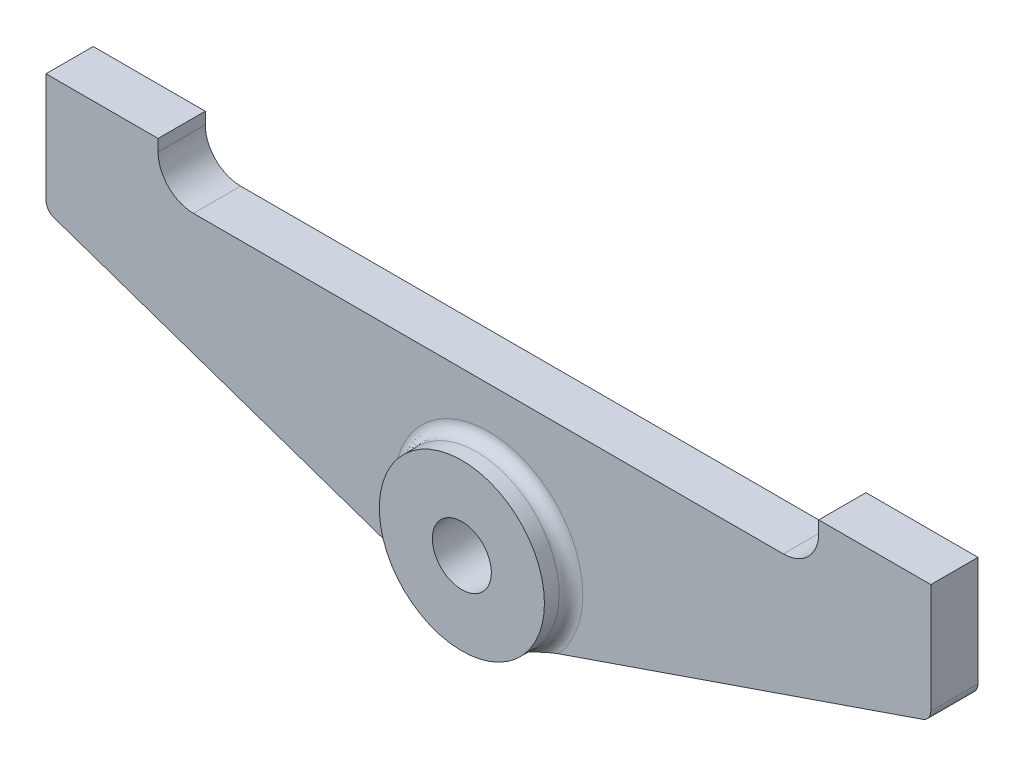
ISO-10303-21;
HEADER;
FILE_DESCRIPTION(('STEP AP214'),'2;1');
FILE_NAME('part.step','',(''),(''),'','','');
FILE_SCHEMA(('AUTOMOTIVE_DESIGN { 1 0 10303 214 1 1 1 1 }'));
ENDSEC;
DATA;
#1=APPLICATION_CONTEXT('core data for automotive mechanical design processes');
#2=APPLICATION_PROTOCOL_DEFINITION('international standard','automotive_design',2000,#1);
#3=PRODUCT_CONTEXT('',#1,'mechanical');
#4=PRODUCT('Part','Part','',(#3));
#5=PRODUCT_RELATED_PRODUCT_CATEGORY('part','',(#4));
#6=PRODUCT_DEFINITION_FORMATION('','',#4);
#7=PRODUCT_DEFINITION_CONTEXT('part definition',#1,'design');
#8=PRODUCT_DEFINITION('design','',#6,#7);
#9=PRODUCT_DEFINITION_SHAPE('','',#8);
#10=(LENGTH_UNIT() NAMED_UNIT(*) SI_UNIT(.MILLI.,.METRE.));
#11=(NAMED_UNIT(*) PLANE_ANGLE_UNIT() SI_UNIT($,.RADIAN.));
#12=(NAMED_UNIT(*) SI_UNIT($,.STERADIAN.) SOLID_ANGLE_UNIT());
#13=UNCERTAINTY_MEASURE_WITH_UNIT(LENGTH_MEASURE(1.E-05),#10,'distance_accuracy_value','');
#14=(GEOMETRIC_REPRESENTATION_CONTEXT(3) GLOBAL_UNCERTAINTY_ASSIGNED_CONTEXT((#13)) GLOBAL_UNIT_ASSIGNED_CONTEXT((#10,
#11,#12)) REPRESENTATION_CONTEXT('',''));
#15=CARTESIAN_POINT('',(0.,0.,0.));
#16=DIRECTION('',(0.,0.,1.));
#17=DIRECTION('',(1.,0.,0.));
#18=AXIS2_PLACEMENT_3D('',#15,#16,#17);
#19=CARTESIAN_POINT('',(0.,115.,20.));
#20=DIRECTION('',(0.,-1.,0.));
#21=DIRECTION('',(1.,0.,0.));
#22=AXIS2_PLACEMENT_3D('',#19,#20,#21);
#23=PLANE('',#22);
#24=DIRECTION('',(-1.,0.,0.));
#25=VECTOR('',#24,1.);
#26=CARTESIAN_POINT('',(0.,115.,20.));
#27=LINE('',#26,#25);
#28=CARTESIAN_POINT('',(250.,115.,20.));
#29=VERTEX_POINT('',#28);
#30=CARTESIAN_POINT('',(-250.,115.,20.));
#31=VERTEX_POINT('',#30);
#32=EDGE_CURVE('E170',#29,#31,#27,.T.);
#33=ORIENTED_EDGE('',*,*,#32,.F.);
#34=DIRECTION('',(0.,0.,-1.));
#35=VECTOR('',#34,1.);
#36=CARTESIAN_POINT('',(250.,115.,-20.));
#37=LINE('',#36,#35);
#38=CARTESIAN_POINT('',(250.,115.,-20.));
#39=VERTEX_POINT('',#38);
#40=EDGE_CURVE('E346',#29,#39,#37,.T.);
#41=ORIENTED_EDGE('',*,*,#40,.T.);
#42=DIRECTION('',(-1.,0.,0.));
#43=VECTOR('',#42,1.);
#44=CARTESIAN_POINT('',(0.,115.,-20.));
#45=LINE('',#44,#43);
#46=CARTESIAN_POINT('',(-250.,115.,-20.));
#47=VERTEX_POINT('',#46);
#48=EDGE_CURVE('E193',#39,#47,#45,.T.);
#49=ORIENTED_EDGE('',*,*,#48,.T.);
#50=DIRECTION('',(0.,0.,-1.));
#51=VECTOR('',#50,1.);
#52=CARTESIAN_POINT('',(-250.,115.,20.));
#53=LINE('',#52,#51);
#54=EDGE_CURVE('E350',#47,#31,#53,.F.);
#55=ORIENTED_EDGE('',*,*,#54,.T.);
#56=EDGE_LOOP('',(#33,#41,#49,#55));
#57=FACE_BOUND('',#56,.T.);
#58=ADVANCED_FACE('F39',(#57),#23,.F.);
#59=CARTESIAN_POINT('',(-280.,-3.88578058618805E-13,20.));
#60=DIRECTION('',(1.,0.,0.));
#61=DIRECTION('',(0.,1.,0.));
#62=AXIS2_PLACEMENT_3D('',#59,#60,#61);
#63=PLANE('',#62);
#64=DIRECTION('',(0.,-1.,0.));
#65=VECTOR('',#64,1.);
#66=CARTESIAN_POINT('',(-280.,-3.88578058618805E-13,20.));
#67=LINE('',#66,#65);
#68=CARTESIAN_POINT('',(-280.,155.,20.));
#69=VERTEX_POINT('',#68);
#70=CARTESIAN_POINT('',(-280.,145.,20.));
#71=VERTEX_POINT('',#70);
#72=EDGE_CURVE('E153',#69,#71,#67,.T.);
#73=ORIENTED_EDGE('',*,*,#72,.T.);
#74=DIRECTION('',(0.,0.,-1.));
#75=VECTOR('',#74,1.);
#76=CARTESIAN_POINT('',(-280.,145.,20.));
#77=LINE('',#76,#75);
#78=CARTESIAN_POINT('',(-280.,145.,-20.));
#79=VERTEX_POINT('',#78);
#80=EDGE_CURVE('E353',#71,#79,#77,.T.);
#81=ORIENTED_EDGE('',*,*,#80,.T.);
#82=DIRECTION('',(0.,-1.,0.));
#83=VECTOR('',#82,1.);
#84=CARTESIAN_POINT('',(-280.,-3.88578058618805E-13,-20.));
#85=LINE('',#84,#83);
#86=CARTESIAN_POINT('',(-280.,155.,-20.));
#87=VERTEX_POINT('',#86);
#88=EDGE_CURVE('E154',#87,#79,#85,.T.);
#89=ORIENTED_EDGE('',*,*,#88,.F.);
#90=DIRECTION('',(0.,0.,-1.));
#91=VECTOR('',#90,1.);
#92=CARTESIAN_POINT('',(-280.,155.,20.));
#93=LINE('',#92,#91);
#94=EDGE_CURVE('E151',#69,#87,#93,.T.);
#95=ORIENTED_EDGE('',*,*,#94,.F.);
#96=EDGE_LOOP('',(#73,#81,#89,#95));
#97=FACE_BOUND('',#96,.T.);
#98=ADVANCED_FACE('F155',(#97),#63,.T.);
#99=CARTESIAN_POINT('',(0.,155.,20.));
#100=DIRECTION('',(0.,1.,0.));
#101=DIRECTION('',(0.,0.,1.));
#102=AXIS2_PLACEMENT_3D('',#99,#100,#101);
#103=PLANE('',#102);
#104=DIRECTION('',(1.,0.,0.));
#105=VECTOR('',#104,1.);
#106=CARTESIAN_POINT('',(0.,155.,-20.));
#107=LINE('',#106,#105);
#108=CARTESIAN_POINT('',(-375.,155.,-20.));
#109=VERTEX_POINT('',#108);
#110=EDGE_CURVE('E198',#109,#87,#107,.T.);
#111=ORIENTED_EDGE('',*,*,#110,.F.);
#112=DIRECTION('',(0.,0.,-1.));
#113=VECTOR('',#112,1.);
#114=CARTESIAN_POINT('',(-375.,155.,20.));
#115=LINE('',#114,#113);
#116=CARTESIAN_POINT('',(-375.,155.,20.));
#117=VERTEX_POINT('',#116);
#118=EDGE_CURVE('E161',#117,#109,#115,.T.);
#119=ORIENTED_EDGE('',*,*,#118,.F.);
#120=DIRECTION('',(1.,0.,0.));
#121=VECTOR('',#120,1.);
#122=CARTESIAN_POINT('',(0.,155.,20.));
#123=LINE('',#122,#121);
#124=EDGE_CURVE('E167',#117,#69,#123,.T.);
#125=ORIENTED_EDGE('',*,*,#124,.T.);
#126=ORIENTED_EDGE('',*,*,#94,.T.);
#127=EDGE_LOOP('',(#111,#119,#125,#126));
#128=FACE_BOUND('',#127,.T.);
#129=ADVANCED_FACE('F168',(#128),#103,.T.);
#130=CARTESIAN_POINT('',(-375.,0.,20.));
#131=DIRECTION('',(-1.,0.,0.));
#132=DIRECTION('',(0.,0.,1.));
#133=AXIS2_PLACEMENT_3D('',#130,#131,#132);
#134=PLANE('',#133);
#135=DIRECTION('',(0.,1.,0.));
#136=VECTOR('',#135,1.);
#137=CARTESIAN_POINT('',(-375.,0.,-20.));
#138=LINE('',#137,#136);
#139=CARTESIAN_POINT('',(-375.,62.1346429358154,-20.));
#140=VERTEX_POINT('',#139);
#141=EDGE_CURVE('E196',#140,#109,#138,.T.);
#142=ORIENTED_EDGE('',*,*,#141,.F.);
#143=DIRECTION('',(0.,0.,-1.));
#144=VECTOR('',#143,1.);
#145=CARTESIAN_POINT('',(-375.,62.1346429358154,20.));
#146=LINE('',#145,#144);
#147=CARTESIAN_POINT('',(-375.,62.1346429358154,20.));
#148=VERTEX_POINT('',#147);
#149=EDGE_CURVE('E236',#140,#148,#146,.F.);
#150=ORIENTED_EDGE('',*,*,#149,.T.);
#151=DIRECTION('',(0.,1.,0.));
#152=VECTOR('',#151,1.);
#153=CARTESIAN_POINT('',(-375.,0.,20.));
#154=LINE('',#153,#152);
#155=EDGE_CURVE('E175',#148,#117,#154,.T.);
#156=ORIENTED_EDGE('',*,*,#155,.T.);
#157=ORIENTED_EDGE('',*,*,#118,.T.);
#158=EDGE_LOOP('',(#142,#150,#156,#157));
#159=FACE_BOUND('',#158,.T.);
#160=ADVANCED_FACE('F277',(#159),#134,.T.);
#161=CARTESIAN_POINT('',(-22.7747490496245,-66.1914707928946,20.));
#162=DIRECTION('',(-0.325353557851779,-0.945592439898495,0.));
#163=DIRECTION('',(0.945592439898495,-0.325353557851779,0.));
#164=AXIS2_PLACEMENT_3D('',#161,#162,#163);
#165=PLANE('',#164);
#166=DIRECTION('',(-0.945592439898495,0.325353557851779,0.));
#167=VECTOR('',#166,1.);
#168=CARTESIAN_POINT('',(-22.7747490496245,-66.1914707928946,20.));
#169=LINE('',#168,#167);
#170=CARTESIAN_POINT('',(-59.3973867698898,-53.5905816810018,20.));
#171=VERTEX_POINT('',#170);
#172=CARTESIAN_POINT('',(-368.253535578518,52.6787185368305,20.));
#173=VERTEX_POINT('',#172);
#174=EDGE_CURVE('E173',#171,#173,#169,.T.);
#175=ORIENTED_EDGE('',*,*,#174,.T.);
#176=DIRECTION('',(0.,0.,-1.));
#177=VECTOR('',#176,1.);
#178=CARTESIAN_POINT('',(-368.253535578518,52.6787185368305,20.));
#179=LINE('',#178,#177);
#180=CARTESIAN_POINT('',(-368.253535578518,52.6787185368305,-20.));
#181=VERTEX_POINT('',#180);
#182=EDGE_CURVE('E232',#173,#181,#179,.T.);
#183=ORIENTED_EDGE('',*,*,#182,.T.);
#184=DIRECTION('',(-0.945592439898495,0.325353557851779,0.));
#185=VECTOR('',#184,1.);
#186=CARTESIAN_POINT('',(-22.7747490496245,-66.1914707928946,-20.));
#187=LINE('',#186,#185);
#188=CARTESIAN_POINT('',(-59.3973867698898,-53.5905816810018,-20.));
#189=VERTEX_POINT('',#188);
#190=EDGE_CURVE('E199',#189,#181,#187,.T.);
#191=ORIENTED_EDGE('',*,*,#190,.F.);
#192=CARTESIAN_POINT('',(-59.3973867698898,-53.5905816810018,-20.));
#193=CARTESIAN_POINT('',(-59.0260316504525,-53.7183552378085,-20.0000108187344));
#194=CARTESIAN_POINT('',(-58.6546955385982,-53.8461222546045,-20.0054220064182));
#195=CARTESIAN_POINT('',(-57.9123145948687,-54.1015560663952,-20.0263673057299));
#196=CARTESIAN_POINT('',(-57.5412697367176,-54.2292228704308,-20.0419003645525));
#197=CARTESIAN_POINT('',(-56.7998604067485,-54.4843223754098,-20.0824002315136));
#198=CARTESIAN_POINT('',(-56.4294956664168,-54.6117551687417,-20.1073616112963));
#199=CARTESIAN_POINT('',(-55.6893898749287,-54.8664061603181,-20.166114990627));
#200=CARTESIAN_POINT('',(-55.3196488429558,-54.9936243519621,-20.1999072569769));
#201=CARTESIAN_POINT('',(-54.2135517844252,-55.3742033394178,-20.3134713294302));
#202=CARTESIAN_POINT('',(-53.4783047573858,-55.6271825575817,-20.4055469160525));
#203=CARTESIAN_POINT('',(-52.0115085725691,-56.131868654083,-20.6185717300036));
#204=CARTESIAN_POINT('',(-51.2799600470955,-56.3835753148614,-20.739525734625));
#205=CARTESIAN_POINT('',(-49.8273401850121,-56.8833837105225,-21.0056890619337));
#206=CARTESIAN_POINT('',(-49.1062328950336,-57.1314978160166,-21.1506802827535));
#207=CARTESIAN_POINT('',(-47.6682826634237,-57.6262587765825,-21.4626652846524));
#208=CARTESIAN_POINT('',(-46.951439901482,-57.8729055698279,-21.6296599861012));
#209=CARTESIAN_POINT('',(-45.5215508712773,-58.3648928824171,-21.9831215283727));
#210=CARTESIAN_POINT('',(-44.8085076070761,-58.610232368142,-22.1696018988783));
#211=CARTESIAN_POINT('',(-43.3865930390222,-59.099475877457,-22.5595522472506));
#212=CARTESIAN_POINT('',(-42.6777218017207,-59.3433798781484,-22.7630224953543));
#213=CARTESIAN_POINT('',(-41.1585875401379,-59.8660741341575,-23.2162035668402));
#214=CARTESIAN_POINT('',(-40.3489586212955,-60.1446462104246,-23.4682864908147));
#215=CARTESIAN_POINT('',(-38.734467446616,-60.7001502792375,-23.989012850719));
#216=CARTESIAN_POINT('',(-37.9296053700097,-60.9770822101145,-24.2576569050598));
#217=CARTESIAN_POINT('',(-35.5217849385116,-61.8055500689948,-25.0841036396305));
#218=CARTESIAN_POINT('',(-33.9251713638538,-62.3549029245284,-25.6625495982535));
#219=CARTESIAN_POINT('',(-30.7409827313629,-63.4504987190164,-26.8556566469305));
#220=CARTESIAN_POINT('',(-29.1534296586136,-63.9967340934799,-27.4703822971833));
#221=CARTESIAN_POINT('',(-25.9844238297866,-65.0871058834359,-28.7171444273322));
#222=CARTESIAN_POINT('',(-24.4029711923367,-65.6312422581116,-29.349181241941));
#223=CARTESIAN_POINT('',(-22.8059520077258,-66.1807346733939,-29.987527809775));
#224=CARTESIAN_POINT('',(-22.7903505284301,-66.1861027332286,-29.99376390542));
#225=CARTESIAN_POINT('',(-22.7747490496245,-66.1914707928946,-30.));
#226=B_SPLINE_CURVE_WITH_KNOTS('',3,(#192,#193,#194,#195,#196,#197,#198,#199,#200,#201,#202,
#203,#204,#205,#206,#207,#208,#209,#210,#211,#212,#213,#214,#215,#216,#217,#218,#219,#220,#221,
#222,#223,#224,#225),.UNSPECIFIED.,.F.,.F.,(4,2,2,2,2,2,2,2,2,2,2,2,2,2,2,2,4),(0.,
1.17809995057752,2.35607738310343,3.53337762637551,4.7107134427919,7.05898169989058,
9.40763869528582,11.7360472704723,14.064553270128,16.3946869258984,18.7248576512821,
21.4023050670364,24.0798525222899,29.4335577856076,34.797095451106,40.1607368943486,
40.21365192057),.UNSPECIFIED.);
#227=CARTESIAN_POINT('',(-22.7747490496246,-66.1914707928946,-30.));
#228=VERTEX_POINT('',#227);
#229=EDGE_CURVE('E253',#189,#228,#226,.T.);
#230=ORIENTED_EDGE('',*,*,#229,.T.);
#231=DIRECTION('',(0.,0.,-1.));
#232=VECTOR('',#231,1.);
#233=CARTESIAN_POINT('',(-22.7747490496246,-66.1914707928945,20.));
#234=LINE('',#233,#232);
#235=CARTESIAN_POINT('',(-22.7747490496246,-66.1914707928946,30.));
#236=VERTEX_POINT('',#235);
#237=EDGE_CURVE('E219',#236,#228,#234,.T.);
#238=ORIENTED_EDGE('',*,*,#237,.F.);
#239=CARTESIAN_POINT('',(-59.3973867698898,-53.5905816810018,20.));
#240=CARTESIAN_POINT('',(-59.0260316504525,-53.7183552378085,20.0000108187344));
#241=CARTESIAN_POINT('',(-58.6546955385982,-53.8461222546045,20.0054220064182));
#242=CARTESIAN_POINT('',(-57.9123145948687,-54.1015560663952,20.0263673057299));
#243=CARTESIAN_POINT('',(-57.5412697367176,-54.2292228704308,20.0419003645525));
#244=CARTESIAN_POINT('',(-56.7998604067485,-54.4843223754098,20.0824002315136));
#245=CARTESIAN_POINT('',(-56.4294956664167,-54.6117551687417,20.1073616112963));
#246=CARTESIAN_POINT('',(-55.6893898749287,-54.8664061603181,20.1661149906269));
#247=CARTESIAN_POINT('',(-55.3196488429558,-54.9936243519621,20.1999072569769));
#248=CARTESIAN_POINT('',(-54.2135517844252,-55.3742033394178,20.3134713294302));
#249=CARTESIAN_POINT('',(-53.4783047573858,-55.6271825575817,20.4055469160525));
#250=CARTESIAN_POINT('',(-52.0115085725691,-56.131868654083,20.6185717300036));
#251=CARTESIAN_POINT('',(-51.2799600470955,-56.3835753148614,20.739525734625));
#252=CARTESIAN_POINT('',(-49.8273401850121,-56.8833837105225,21.0056890619337));
#253=CARTESIAN_POINT('',(-49.1062328950336,-57.1314978160166,21.1506802827535));
#254=CARTESIAN_POINT('',(-47.6682826634237,-57.6262587765825,21.4626652846524));
#255=CARTESIAN_POINT('',(-46.951439901482,-57.8729055698279,21.6296599861012));
#256=CARTESIAN_POINT('',(-45.5215508712773,-58.3648928824171,21.9831215283727));
#257=CARTESIAN_POINT('',(-44.8085076070762,-58.610232368142,22.1696018988783));
#258=CARTESIAN_POINT('',(-43.3865930390222,-59.099475877457,22.5595522472506));
#259=CARTESIAN_POINT('',(-42.6777218017207,-59.3433798781484,22.7630224953543));
#260=CARTESIAN_POINT('',(-41.1585875401379,-59.8660741341575,23.2162035668402));
#261=CARTESIAN_POINT('',(-40.3489586212955,-60.1446462104246,23.4682864908147));
#262=CARTESIAN_POINT('',(-38.734467446616,-60.7001502792375,23.989012850719));
#263=CARTESIAN_POINT('',(-37.9296053700097,-60.9770822101145,24.2576569050598));
#264=CARTESIAN_POINT('',(-35.5217849385116,-61.8055500689948,25.0841036396305));
#265=CARTESIAN_POINT('',(-33.9251713638538,-62.3549029245284,25.6625495982535));
#266=CARTESIAN_POINT('',(-30.7409827313629,-63.4504987190164,26.8556566469305));
#267=CARTESIAN_POINT('',(-29.1534296586136,-63.9967340934799,27.4703822971833));
#268=CARTESIAN_POINT('',(-25.9844238297866,-65.0871058834359,28.7171444273322));
#269=CARTESIAN_POINT('',(-24.4029711923367,-65.6312422581116,29.349181241941));
#270=CARTESIAN_POINT('',(-22.8059520077258,-66.1807346733939,29.987527809775));
#271=CARTESIAN_POINT('',(-22.7903505284301,-66.1861027332286,29.99376390542));
#272=CARTESIAN_POINT('',(-22.7747490496245,-66.1914707928946,30.));
#273=B_SPLINE_CURVE_WITH_KNOTS('',3,(#239,#240,#241,#242,#243,#244,#245,#246,#247,#248,#249,
#250,#251,#252,#253,#254,#255,#256,#257,#258,#259,#260,#261,#262,#263,#264,#265,#266,#267,#268,
#269,#270,#271,#272),.UNSPECIFIED.,.F.,.F.,(4,2,2,2,2,2,2,2,2,2,2,2,2,2,2,2,4),(0.,
1.17809995057753,2.35607738310344,3.53337762637552,4.7107134427919,7.05898169989058,
9.40763869528582,11.7360472704723,14.064553270128,16.3946869258984,18.7248576512821,
21.4023050670364,24.0798525222899,29.4335577856075,34.797095451106,40.1607368943486,
40.2136519205699),.UNSPECIFIED.);
#274=EDGE_CURVE('E285',#236,#171,#273,.F.);
#275=ORIENTED_EDGE('',*,*,#274,.T.);
#276=EDGE_LOOP('',(#175,#183,#191,#230,#238,#275));
#277=FACE_BOUND('',#276,.T.);
#278=ADVANCED_FACE('F271',(#277),#165,.T.);
#279=CARTESIAN_POINT('',(22.7747490496246,-66.1914707928947,20.));
#280=DIRECTION('',(-0.325353557851779,0.945592439898495,0.));
#281=DIRECTION('',(-0.945592439898495,-0.325353557851779,0.));
#282=AXIS2_PLACEMENT_3D('',#279,#280,#281);
#283=PLANE('',#282);
#284=DIRECTION('',(0.945592439898495,0.325353557851779,0.));
#285=VECTOR('',#284,1.);
#286=CARTESIAN_POINT('',(22.7747490496246,-66.1914707928947,-20.));
#287=LINE('',#286,#285);
#288=CARTESIAN_POINT('',(59.3973867698897,-53.5905816810019,-20.));
#289=VERTEX_POINT('',#288);
#290=CARTESIAN_POINT('',(368.253535578518,52.6787185368304,-20.));
#291=VERTEX_POINT('',#290);
#292=EDGE_CURVE('E201',#289,#291,#287,.T.);
#293=ORIENTED_EDGE('',*,*,#292,.T.);
#294=DIRECTION('',(0.,0.,-1.));
#295=VECTOR('',#294,1.);
#296=CARTESIAN_POINT('',(368.253535578518,52.6787185368304,20.));
#297=LINE('',#296,#295);
#298=CARTESIAN_POINT('',(368.253535578518,52.6787185368304,20.));
#299=VERTEX_POINT('',#298);
#300=EDGE_CURVE('E249',#291,#299,#297,.F.);
#301=ORIENTED_EDGE('',*,*,#300,.T.);
#302=DIRECTION('',(0.945592439898495,0.325353557851779,0.));
#303=VECTOR('',#302,1.);
#304=CARTESIAN_POINT('',(22.7747490496246,-66.1914707928947,20.));
#305=LINE('',#304,#303);
#306=CARTESIAN_POINT('',(59.3973867698897,-53.5905816810019,20.));
#307=VERTEX_POINT('',#306);
#308=EDGE_CURVE('E177',#307,#299,#305,.T.);
#309=ORIENTED_EDGE('',*,*,#308,.F.);
#310=CARTESIAN_POINT('',(59.3973867698897,-53.5905816810019,20.));
#311=CARTESIAN_POINT('',(59.0260316504784,-53.7183552377997,20.0000108187344));
#312=CARTESIAN_POINT('',(58.65469553865,-53.8461222545868,20.0054220064175));
#313=CARTESIAN_POINT('',(57.9123145949725,-54.1015560663596,20.0263673057263));
#314=CARTESIAN_POINT('',(57.5412697368474,-54.2292228703862,20.0419003645467));
#315=CARTESIAN_POINT('',(56.79986040693,-54.4843223753474,20.0824002315024));
#316=CARTESIAN_POINT('',(56.4294956666241,-54.6117551686704,20.1073616112817));
#317=CARTESIAN_POINT('',(55.6893898751875,-54.8664061602292,20.1661149906045));
#318=CARTESIAN_POINT('',(55.3196488432402,-54.9936243518644,20.19990725695));
#319=CARTESIAN_POINT('',(54.2135517847755,-55.3742033392974,20.3134713293895));
#320=CARTESIAN_POINT('',(53.4783047577762,-55.6271825574475,20.4055469160015));
#321=CARTESIAN_POINT('',(52.0115085730392,-56.1318686539214,20.6185717299295));
#322=CARTESIAN_POINT('',(51.2799600476052,-56.3835753146861,20.7395257345381));
#323=CARTESIAN_POINT('',(49.8273401855117,-56.8833837103507,21.0056890618356));
#324=CARTESIAN_POINT('',(49.1062328954841,-57.1314978158617,21.15068028266));
#325=CARTESIAN_POINT('',(47.6682826637765,-57.6262587764612,21.4626652845716));
#326=CARTESIAN_POINT('',(46.9514399017863,-57.8729055697233,21.6296599860285));
#327=CARTESIAN_POINT('',(45.5215508714899,-58.364892882344,21.9831215283176));
#328=CARTESIAN_POINT('',(44.8085076072456,-58.6102323680838,22.1696018988326));
#329=CARTESIAN_POINT('',(43.3865930391064,-59.0994758774281,22.5595522472265));
#330=CARTESIAN_POINT('',(42.6777218017627,-59.3433798781341,22.7630224953423));
#331=CARTESIAN_POINT('',(41.1585875401339,-59.8660741341589,23.2162035668405));
#332=CARTESIAN_POINT('',(40.3489586212873,-60.1446462104276,23.4682864908139));
#333=CARTESIAN_POINT('',(38.7344674466025,-60.7001502792422,23.9890128507266));
#334=CARTESIAN_POINT('',(37.9296053699951,-60.9770822101197,24.2576569050768));
#335=CARTESIAN_POINT('',(35.521784938461,-61.8055500690124,25.0841036396235));
#336=CARTESIAN_POINT('',(33.9251713637483,-62.354902924565,25.6625495981569));
#337=CARTESIAN_POINT('',(30.7409827313339,-63.4504987190263,26.8556566470773));
#338=CARTESIAN_POINT('',(29.1534296587162,-63.9967340934441,27.4703822976634));
#339=CARTESIAN_POINT('',(25.9844238295904,-65.0871058835041,28.7171444268876));
#340=CARTESIAN_POINT('',(24.4029711917102,-65.6312422583296,29.3491812402385));
#341=CARTESIAN_POINT('',(22.8059520077137,-66.1807346733981,29.9875278097414));
#342=CARTESIAN_POINT('',(22.790350528424,-66.1861027332307,29.9937639054031));
#343=CARTESIAN_POINT('',(22.7747490496246,-66.1914707928946,30.));
#344=B_SPLINE_CURVE_WITH_KNOTS('',3,(#310,#311,#312,#313,#314,#315,#316,#317,#318,#319,#320,
#321,#322,#323,#324,#325,#326,#327,#328,#329,#330,#331,#332,#333,#334,#335,#336,#337,#338,#339,
#340,#341,#342,#343),.UNSPECIFIED.,.F.,.F.,(4,2,2,2,2,2,2,2,2,2,2,2,2,2,2,2,4),(0.,
1.17809995049501,2.35607738293844,3.53337762612827,4.71071344246241,7.05898169943125,
9.40763869469648,11.7360472700386,14.0645532698499,16.3946869257599,18.7248576512823,
21.4023050670479,24.0798525223147,29.4335577857004,34.7970954511615,40.1607368943486,
40.2136519205699),.UNSPECIFIED.);
#345=CARTESIAN_POINT('',(22.7747490496246,-66.1914707928947,30.));
#346=VERTEX_POINT('',#345);
#347=EDGE_CURVE('E289',#307,#346,#344,.T.);
#348=ORIENTED_EDGE('',*,*,#347,.T.);
#349=DIRECTION('',(0.,0.,-1.));
#350=VECTOR('',#349,1.);
#351=CARTESIAN_POINT('',(22.7747490496246,-66.1914707928947,20.));
#352=LINE('',#351,#350);
#353=CARTESIAN_POINT('',(22.7747490496246,-66.1914707928947,-30.));
#354=VERTEX_POINT('',#353);
#355=EDGE_CURVE('E217',#346,#354,#352,.T.);
#356=ORIENTED_EDGE('',*,*,#355,.T.);
#357=CARTESIAN_POINT('',(59.3973867698897,-53.5905816810019,-20.));
#358=CARTESIAN_POINT('',(59.0260316504799,-53.7183552377992,-20.0000108187344));
#359=CARTESIAN_POINT('',(58.654695538653,-53.8461222545857,-20.0054220064174));
#360=CARTESIAN_POINT('',(57.9123145949785,-54.1015560663575,-20.0263673057261));
#361=CARTESIAN_POINT('',(57.5412697368549,-54.2292228703837,-20.0419003645464));
#362=CARTESIAN_POINT('',(56.7998604069404,-54.4843223753438,-20.0824002315017));
#363=CARTESIAN_POINT('',(56.4294956666359,-54.6117551686663,-20.1073616112809));
#364=CARTESIAN_POINT('',(55.6893898752023,-54.8664061602241,-20.1661149906033));
#365=CARTESIAN_POINT('',(55.3196488432565,-54.9936243518588,-20.1999072569485));
#366=CARTESIAN_POINT('',(54.2135517847956,-55.3742033392905,-20.3134713293872));
#367=CARTESIAN_POINT('',(53.4783047577985,-55.6271825574398,-20.4055469159986));
#368=CARTESIAN_POINT('',(52.0115085730661,-56.1318686539122,-20.6185717299253));
#369=CARTESIAN_POINT('',(51.2799600476343,-56.3835753146761,-20.7395257345332));
#370=CARTESIAN_POINT('',(49.8273401855403,-56.8833837103409,-21.00568906183));
#371=CARTESIAN_POINT('',(49.1062328955099,-57.1314978158528,-21.1506802826546));
#372=CARTESIAN_POINT('',(47.6682826637967,-57.6262587764543,-21.462665284567));
#373=CARTESIAN_POINT('',(46.9514399018037,-57.8729055697173,-21.6296599860243));
#374=CARTESIAN_POINT('',(45.5215508715021,-58.3648928823398,-21.9831215283144));
#375=CARTESIAN_POINT('',(44.8085076072554,-58.6102323680805,-22.16960189883));
#376=CARTESIAN_POINT('',(43.3865930391112,-59.0994758774265,-22.5595522472252));
#377=CARTESIAN_POINT('',(42.6777218017652,-59.3433798781332,-22.7630224953417));
#378=CARTESIAN_POINT('',(41.1585875401337,-59.866074134159,-23.2162035668405));
#379=CARTESIAN_POINT('',(40.3489586212868,-60.1446462104277,-23.4682864908139));
#380=CARTESIAN_POINT('',(38.7344674466018,-60.7001502792425,-23.989012850727));
#381=CARTESIAN_POINT('',(37.9296053699943,-60.9770822101199,-24.2576569050778));
#382=CARTESIAN_POINT('',(35.5217849384582,-61.8055500690133,-25.0841036396231));
#383=CARTESIAN_POINT('',(33.9251713637423,-62.3549029245671,-25.6625495981513));
#384=CARTESIAN_POINT('',(30.7409827313324,-63.4504987190268,-26.8556566470857));
#385=CARTESIAN_POINT('',(29.1534296587222,-63.996734093442,-27.4703822976908));
#386=CARTESIAN_POINT('',(25.9844238295794,-65.087105883508,-28.7171444268622));
#387=CARTESIAN_POINT('',(24.4029711916746,-65.631242258342,-29.349181240141));
#388=CARTESIAN_POINT('',(22.8059520077132,-66.1807346733983,-29.9875278097395));
#389=CARTESIAN_POINT('',(22.7903505284237,-66.1861027332308,-29.9937639054021));
#390=CARTESIAN_POINT('',(22.7747490496246,-66.1914707928946,-30.));
#391=B_SPLINE_CURVE_WITH_KNOTS('',3,(#357,#358,#359,#360,#361,#362,#363,#364,#365,#366,#367,
#368,#369,#370,#371,#372,#373,#374,#375,#376,#377,#378,#379,#380,#381,#382,#383,#384,#385,#386,
#387,#388,#389,#390),.UNSPECIFIED.,.F.,.F.,(4,2,2,2,2,2,2,2,2,2,2,2,2,2,2,2,4),(0.,
1.17809995049029,2.35607738292899,3.53337762611411,4.71071344244355,7.05898169940497,
9.40763869466276,11.7360472700138,14.0645532698339,16.3946869257519,18.7248576512823,
21.4023050670485,24.0798525223161,29.4335577857056,34.7970954511645,40.1607368943483,
40.2136519205699),.UNSPECIFIED.);
#392=EDGE_CURVE('E257',#354,#289,#391,.F.);
#393=ORIENTED_EDGE('',*,*,#392,.T.);
#394=EDGE_LOOP('',(#293,#301,#309,#348,#356,#393));
#395=FACE_BOUND('',#394,.T.);
#396=ADVANCED_FACE('F274',(#395),#283,.F.);
#397=CARTESIAN_POINT('',(375.,0.,20.));
#398=DIRECTION('',(-1.,0.,0.));
#399=DIRECTION('',(0.,0.,1.));
#400=AXIS2_PLACEMENT_3D('',#397,#398,#399);
#401=PLANE('',#400);
#402=DIRECTION('',(0.,1.,0.));
#403=VECTOR('',#402,1.);
#404=CARTESIAN_POINT('',(375.,0.,20.));
#405=LINE('',#404,#403);
#406=CARTESIAN_POINT('',(375.,62.1346429358154,20.));
#407=VERTEX_POINT('',#406);
#408=CARTESIAN_POINT('',(375.,155.,20.));
#409=VERTEX_POINT('',#408);
#410=EDGE_CURVE('E181',#407,#409,#405,.T.);
#411=ORIENTED_EDGE('',*,*,#410,.F.);
#412=DIRECTION('',(0.,0.,-1.));
#413=VECTOR('',#412,1.);
#414=CARTESIAN_POINT('',(375.,62.1346429358154,20.));
#415=LINE('',#414,#413);
#416=CARTESIAN_POINT('',(375.,62.1346429358154,-20.));
#417=VERTEX_POINT('',#416);
#418=EDGE_CURVE('E248',#407,#417,#415,.T.);
#419=ORIENTED_EDGE('',*,*,#418,.T.);
#420=DIRECTION('',(0.,1.,0.));
#421=VECTOR('',#420,1.);
#422=CARTESIAN_POINT('',(375.,0.,-20.));
#423=LINE('',#422,#421);
#424=CARTESIAN_POINT('',(375.,155.,-20.));
#425=VERTEX_POINT('',#424);
#426=EDGE_CURVE('E206',#417,#425,#423,.T.);
#427=ORIENTED_EDGE('',*,*,#426,.T.);
#428=DIRECTION('',(0.,0.,-1.));
#429=VECTOR('',#428,1.);
#430=CARTESIAN_POINT('',(375.,155.,20.));
#431=LINE('',#430,#429);
#432=EDGE_CURVE('E214',#409,#425,#431,.T.);
#433=ORIENTED_EDGE('',*,*,#432,.F.);
#434=EDGE_LOOP('',(#411,#419,#427,#433));
#435=FACE_BOUND('',#434,.T.);
#436=ADVANCED_FACE('F380',(#435),#401,.F.);
#437=CARTESIAN_POINT('',(0.,155.,20.));
#438=DIRECTION('',(0.,-1.,0.));
#439=DIRECTION('',(0.,0.,-1.));
#440=AXIS2_PLACEMENT_3D('',#437,#438,#439);
#441=PLANE('',#440);
#442=DIRECTION('',(-1.,0.,0.));
#443=VECTOR('',#442,1.);
#444=CARTESIAN_POINT('',(0.,155.,-20.));
#445=LINE('',#444,#443);
#446=CARTESIAN_POINT('',(280.,155.,-20.));
#447=VERTEX_POINT('',#446);
#448=EDGE_CURVE('E208',#425,#447,#445,.T.);
#449=ORIENTED_EDGE('',*,*,#448,.T.);
#450=DIRECTION('',(0.,0.,-1.));
#451=VECTOR('',#450,1.);
#452=CARTESIAN_POINT('',(280.,155.,20.));
#453=LINE('',#452,#451);
#454=CARTESIAN_POINT('',(280.,155.,20.));
#455=VERTEX_POINT('',#454);
#456=EDGE_CURVE('E189',#455,#447,#453,.T.);
#457=ORIENTED_EDGE('',*,*,#456,.F.);
#458=DIRECTION('',(-1.,0.,0.));
#459=VECTOR('',#458,1.);
#460=CARTESIAN_POINT('',(0.,155.,20.));
#461=LINE('',#460,#459);
#462=EDGE_CURVE('E183',#409,#455,#461,.T.);
#463=ORIENTED_EDGE('',*,*,#462,.F.);
#464=ORIENTED_EDGE('',*,*,#432,.T.);
#465=EDGE_LOOP('',(#449,#457,#463,#464));
#466=FACE_BOUND('',#465,.T.);
#467=ADVANCED_FACE('F375',(#466),#441,.F.);
#468=CARTESIAN_POINT('',(280.,-3.88578058618804E-13,20.));
#469=DIRECTION('',(1.,0.,0.));
#470=DIRECTION('',(0.,1.,0.));
#471=AXIS2_PLACEMENT_3D('',#468,#469,#470);
#472=PLANE('',#471);
#473=DIRECTION('',(0.,-1.,0.));
#474=VECTOR('',#473,1.);
#475=CARTESIAN_POINT('',(280.,-3.88578058618804E-13,-20.));
#476=LINE('',#475,#474);
#477=CARTESIAN_POINT('',(280.,145.,-20.));
#478=VERTEX_POINT('',#477);
#479=EDGE_CURVE('E209',#447,#478,#476,.T.);
#480=ORIENTED_EDGE('',*,*,#479,.T.);
#481=DIRECTION('',(0.,0.,-1.));
#482=VECTOR('',#481,1.);
#483=CARTESIAN_POINT('',(280.,145.,20.));
#484=LINE('',#483,#482);
#485=CARTESIAN_POINT('',(280.,145.,20.));
#486=VERTEX_POINT('',#485);
#487=EDGE_CURVE('E348',#478,#486,#484,.F.);
#488=ORIENTED_EDGE('',*,*,#487,.T.);
#489=DIRECTION('',(0.,-1.,0.));
#490=VECTOR('',#489,1.);
#491=CARTESIAN_POINT('',(280.,-3.88578058618804E-13,20.));
#492=LINE('',#491,#490);
#493=EDGE_CURVE('E190',#455,#486,#492,.T.);
#494=ORIENTED_EDGE('',*,*,#493,.F.);
#495=ORIENTED_EDGE('',*,*,#456,.T.);
#496=EDGE_LOOP('',(#480,#488,#494,#495));
#497=FACE_BOUND('',#496,.T.);
#498=ADVANCED_FACE('F370',(#497),#472,.F.);
#499=CARTESIAN_POINT('',(0.,0.,20.));
#500=DIRECTION('',(0.,0.,1.));
#501=DIRECTION('',(1.,0.,0.));
#502=AXIS2_PLACEMENT_3D('',#499,#500,#501);
#503=PLANE('',#502);
#504=ORIENTED_EDGE('',*,*,#155,.F.);
#505=CARTESIAN_POINT('',(-365.,62.1346429358154,20.));
#506=DIRECTION('',(0.,0.,1.));
#507=DIRECTION('',(1.,0.,0.));
#508=AXIS2_PLACEMENT_3D('',#505,#506,#507);
#509=CIRCLE('',#508,10.);
#510=EDGE_CURVE('E243',#148,#173,#509,.T.);
#511=ORIENTED_EDGE('',*,*,#510,.T.);
#512=ORIENTED_EDGE('',*,*,#174,.F.);
#513=CARTESIAN_POINT('',(0.,0.,20.));
#514=DIRECTION('',(0.,0.,1.));
#515=DIRECTION('',(1.,0.,0.));
#516=AXIS2_PLACEMENT_3D('',#513,#514,#515);
#517=CIRCLE('',#516,80.);
#518=EDGE_CURVE('E238',#171,#307,#517,.F.);
#519=ORIENTED_EDGE('',*,*,#518,.T.);
#520=ORIENTED_EDGE('',*,*,#308,.T.);
#521=CARTESIAN_POINT('',(365.,62.1346429358154,20.));
#522=DIRECTION('',(0.,0.,1.));
#523=DIRECTION('',(1.,0.,0.));
#524=AXIS2_PLACEMENT_3D('',#521,#522,#523);
#525=CIRCLE('',#524,10.);
#526=EDGE_CURVE('E245',#299,#407,#525,.T.);
#527=ORIENTED_EDGE('',*,*,#526,.T.);
#528=ORIENTED_EDGE('',*,*,#410,.T.);
#529=ORIENTED_EDGE('',*,*,#462,.T.);
#530=ORIENTED_EDGE('',*,*,#493,.T.);
#531=CARTESIAN_POINT('',(250.,145.,20.));
#532=DIRECTION('',(0.,0.,1.));
#533=DIRECTION('',(1.,0.,0.));
#534=AXIS2_PLACEMENT_3D('',#531,#532,#533);
#535=CIRCLE('',#534,30.);
#536=EDGE_CURVE('E356',#486,#29,#535,.F.);
#537=ORIENTED_EDGE('',*,*,#536,.T.);
#538=ORIENTED_EDGE('',*,*,#32,.T.);
#539=CARTESIAN_POINT('',(-250.,145.,20.));
#540=DIRECTION('',(0.,0.,1.));
#541=DIRECTION('',(1.,0.,0.));
#542=AXIS2_PLACEMENT_3D('',#539,#540,#541);
#543=CIRCLE('',#542,30.);
#544=EDGE_CURVE('E11',#31,#71,#543,.F.);
#545=ORIENTED_EDGE('',*,*,#544,.T.);
#546=ORIENTED_EDGE('',*,*,#72,.F.);
#547=ORIENTED_EDGE('',*,*,#124,.F.);
#548=EDGE_LOOP('',(#504,#511,#512,#519,#520,#527,#528,#529,#530,#537,#538,#545,#546,#547));
#549=FACE_BOUND('',#548,.T.);
#550=ADVANCED_FACE('F164',(#549),#503,.T.);
#551=CARTESIAN_POINT('',(0.,0.,-20.));
#552=DIRECTION('',(0.,0.,1.));
#553=DIRECTION('',(1.,0.,0.));
#554=AXIS2_PLACEMENT_3D('',#551,#552,#553);
#555=PLANE('',#554);
#556=ORIENTED_EDGE('',*,*,#292,.F.);
#557=CARTESIAN_POINT('',(0.,0.,-20.));
#558=DIRECTION('',(0.,0.,1.));
#559=DIRECTION('',(1.,0.,0.));
#560=AXIS2_PLACEMENT_3D('',#557,#558,#559);
#561=CIRCLE('',#560,80.);
#562=EDGE_CURVE('E226',#289,#189,#561,.T.);
#563=ORIENTED_EDGE('',*,*,#562,.T.);
#564=ORIENTED_EDGE('',*,*,#190,.T.);
#565=CARTESIAN_POINT('',(-365.,62.1346429358154,-20.));
#566=DIRECTION('',(0.,0.,1.));
#567=DIRECTION('',(1.,0.,0.));
#568=AXIS2_PLACEMENT_3D('',#565,#566,#567);
#569=CIRCLE('',#568,10.);
#570=EDGE_CURVE('E221',#181,#140,#569,.F.);
#571=ORIENTED_EDGE('',*,*,#570,.T.);
#572=ORIENTED_EDGE('',*,*,#141,.T.);
#573=ORIENTED_EDGE('',*,*,#110,.T.);
#574=ORIENTED_EDGE('',*,*,#88,.T.);
#575=CARTESIAN_POINT('',(-250.,145.,-20.));
#576=DIRECTION('',(0.,0.,1.));
#577=DIRECTION('',(1.,0.,0.));
#578=AXIS2_PLACEMENT_3D('',#575,#576,#577);
#579=CIRCLE('',#578,30.);
#580=EDGE_CURVE('E50',#79,#47,#579,.T.);
#581=ORIENTED_EDGE('',*,*,#580,.T.);
#582=ORIENTED_EDGE('',*,*,#48,.F.);
#583=CARTESIAN_POINT('',(250.,145.,-20.));
#584=DIRECTION('',(0.,0.,1.));
#585=DIRECTION('',(1.,0.,0.));
#586=AXIS2_PLACEMENT_3D('',#583,#584,#585);
#587=CIRCLE('',#586,30.);
#588=EDGE_CURVE('E358',#39,#478,#587,.T.);
#589=ORIENTED_EDGE('',*,*,#588,.T.);
#590=ORIENTED_EDGE('',*,*,#479,.F.);
#591=ORIENTED_EDGE('',*,*,#448,.F.);
#592=ORIENTED_EDGE('',*,*,#426,.F.);
#593=CARTESIAN_POINT('',(365.,62.1346429358154,-20.));
#594=DIRECTION('',(0.,0.,1.));
#595=DIRECTION('',(1.,0.,0.));
#596=AXIS2_PLACEMENT_3D('',#593,#594,#595);
#597=CIRCLE('',#596,10.);
#598=EDGE_CURVE('E159',#417,#291,#597,.F.);
#599=ORIENTED_EDGE('',*,*,#598,.T.);
#600=EDGE_LOOP('',(#556,#563,#564,#571,#572,#573,#574,#581,#582,#589,#590,#591,#592,#599));
#601=FACE_BOUND('',#600,.T.);
#602=ADVANCED_FACE('F363',(#601),#555,.F.);
#603=CARTESIAN_POINT('',(0.,0.,42.5));
#604=DIRECTION('',(0.,0.,-1.));
#605=DIRECTION('',(-1.,0.,0.));
#606=AXIS2_PLACEMENT_3D('',#603,#604,#605);
#607=CYLINDRICAL_SURFACE('',#606,25.);
#608=CARTESIAN_POINT('',(0.,0.,42.5));
#609=DIRECTION('',(0.,0.,1.));
#610=DIRECTION('',(1.,0.,0.));
#611=AXIS2_PLACEMENT_3D('',#608,#609,#610);
#612=CIRCLE('',#611,25.);
#613=CARTESIAN_POINT('',(25.,0.,42.5));
#614=VERTEX_POINT('',#613);
#615=EDGE_CURVE('E387',#614,#614,#612,.T.);
#616=ORIENTED_EDGE('',*,*,#615,.T.);
#617=EDGE_LOOP('',(#616));
#618=FACE_BOUND('',#617,.T.);
#619=CARTESIAN_POINT('',(0.,0.,-42.5));
#620=DIRECTION('',(0.,0.,1.));
#621=DIRECTION('',(1.,0.,0.));
#622=AXIS2_PLACEMENT_3D('',#619,#620,#621);
#623=CIRCLE('',#622,25.);
#624=CARTESIAN_POINT('',(25.,0.,-42.5));
#625=VERTEX_POINT('',#624);
#626=EDGE_CURVE('E390',#625,#625,#623,.T.);
#627=ORIENTED_EDGE('',*,*,#626,.F.);
#628=EDGE_LOOP('',(#627));
#629=FACE_BOUND('',#628,.T.);
#630=ADVANCED_FACE('F394',(#618,#629),#607,.F.);
#631=CARTESIAN_POINT('',(0.,0.,42.5));
#632=DIRECTION('',(0.,0.,-1.));
#633=DIRECTION('',(-1.,0.,0.));
#634=AXIS2_PLACEMENT_3D('',#631,#632,#633);
#635=CYLINDRICAL_SURFACE('',#634,70.);
#636=ORIENTED_EDGE('',*,*,#237,.T.);
#637=CARTESIAN_POINT('',(0.,0.,-30.));
#638=DIRECTION('',(0.,0.,1.));
#639=DIRECTION('',(1.,0.,0.));
#640=AXIS2_PLACEMENT_3D('',#637,#638,#639);
#641=CIRCLE('',#640,70.);
#642=EDGE_CURVE('E235',#228,#354,#641,.F.);
#643=ORIENTED_EDGE('',*,*,#642,.T.);
#644=ORIENTED_EDGE('',*,*,#355,.F.);
#645=CARTESIAN_POINT('',(0.,0.,30.));
#646=DIRECTION('',(0.,0.,1.));
#647=DIRECTION('',(1.,0.,0.));
#648=AXIS2_PLACEMENT_3D('',#645,#646,#647);
#649=CIRCLE('',#648,70.);
#650=EDGE_CURVE('E228',#346,#236,#649,.T.);
#651=ORIENTED_EDGE('',*,*,#650,.T.);
#652=EDGE_LOOP('',(#636,#643,#644,#651));
#653=FACE_BOUND('',#652,.T.);
#654=CARTESIAN_POINT('',(0.,0.,42.5));
#655=DIRECTION('',(0.,0.,1.));
#656=DIRECTION('',(1.,0.,0.));
#657=AXIS2_PLACEMENT_3D('',#654,#655,#656);
#658=CIRCLE('',#657,70.);
#659=CARTESIAN_POINT('',(70.,0.,42.5));
#660=VERTEX_POINT('',#659);
#661=EDGE_CURVE('E194',#660,#660,#658,.T.);
#662=ORIENTED_EDGE('',*,*,#661,.F.);
#663=EDGE_LOOP('',(#662));
#664=FACE_BOUND('',#663,.T.);
#665=CARTESIAN_POINT('',(0.,0.,-42.5));
#666=DIRECTION('',(0.,0.,1.));
#667=DIRECTION('',(1.,0.,0.));
#668=AXIS2_PLACEMENT_3D('',#665,#666,#667);
#669=CIRCLE('',#668,70.);
#670=CARTESIAN_POINT('',(70.,0.,-42.5));
#671=VERTEX_POINT('',#670);
#672=EDGE_CURVE('E382',#671,#671,#669,.T.);
#673=ORIENTED_EDGE('',*,*,#672,.T.);
#674=EDGE_LOOP('',(#673));
#675=FACE_BOUND('',#674,.T.);
#676=ADVANCED_FACE('F339',(#653,#664,#675),#635,.T.);
#677=CARTESIAN_POINT('',(0.,0.,42.5));
#678=DIRECTION('',(0.,0.,1.));
#679=DIRECTION('',(1.,0.,0.));
#680=AXIS2_PLACEMENT_3D('',#677,#678,#679);
#681=PLANE('',#680);
#682=ORIENTED_EDGE('',*,*,#615,.F.);
#683=EDGE_LOOP('',(#682));
#684=FACE_BOUND('',#683,.T.);
#685=ORIENTED_EDGE('',*,*,#661,.T.);
#686=EDGE_LOOP('',(#685));
#687=FACE_BOUND('',#686,.T.);
#688=ADVANCED_FACE('F396',(#684,#687),#681,.T.);
#689=CARTESIAN_POINT('',(0.,0.,-42.5));
#690=DIRECTION('',(0.,0.,1.));
#691=DIRECTION('',(1.,0.,0.));
#692=AXIS2_PLACEMENT_3D('',#689,#690,#691);
#693=PLANE('',#692);
#694=ORIENTED_EDGE('',*,*,#626,.T.);
#695=EDGE_LOOP('',(#694));
#696=FACE_BOUND('',#695,.T.);
#697=ORIENTED_EDGE('',*,*,#672,.F.);
#698=EDGE_LOOP('',(#697));
#699=FACE_BOUND('',#698,.T.);
#700=ADVANCED_FACE('F402',(#696,#699),#693,.F.);
#701=CARTESIAN_POINT('',(0.,0.,-30.));
#702=DIRECTION('',(0.,0.,1.));
#703=DIRECTION('',(1.,0.,0.));
#704=AXIS2_PLACEMENT_3D('',#701,#702,#703);
#705=TOROIDAL_SURFACE('',#704,80.,10.);
#706=ORIENTED_EDGE('',*,*,#392,.F.);
#707=ORIENTED_EDGE('',*,*,#642,.F.);
#708=ORIENTED_EDGE('',*,*,#229,.F.);
#709=ORIENTED_EDGE('',*,*,#562,.F.);
#710=EDGE_LOOP('',(#706,#707,#708,#709));
#711=FACE_BOUND('',#710,.T.);
#712=ADVANCED_FACE('F270',(#711),#705,.F.);
#713=CARTESIAN_POINT('',(-365.,62.1346429358154,20.));
#714=DIRECTION('',(0.,0.,-1.));
#715=DIRECTION('',(-1.,0.,0.));
#716=AXIS2_PLACEMENT_3D('',#713,#714,#715);
#717=CYLINDRICAL_SURFACE('',#716,10.);
#718=ORIENTED_EDGE('',*,*,#510,.F.);
#719=ORIENTED_EDGE('',*,*,#149,.F.);
#720=ORIENTED_EDGE('',*,*,#570,.F.);
#721=ORIENTED_EDGE('',*,*,#182,.F.);
#722=EDGE_LOOP('',(#718,#719,#720,#721));
#723=FACE_BOUND('',#722,.T.);
#724=ADVANCED_FACE('F332',(#723),#717,.T.);
#725=CARTESIAN_POINT('',(365.,62.1346429358154,20.));
#726=DIRECTION('',(0.,0.,-1.));
#727=DIRECTION('',(-1.,0.,0.));
#728=AXIS2_PLACEMENT_3D('',#725,#726,#727);
#729=CYLINDRICAL_SURFACE('',#728,10.);
#730=ORIENTED_EDGE('',*,*,#526,.F.);
#731=ORIENTED_EDGE('',*,*,#300,.F.);
#732=ORIENTED_EDGE('',*,*,#598,.F.);
#733=ORIENTED_EDGE('',*,*,#418,.F.);
#734=EDGE_LOOP('',(#730,#731,#732,#733));
#735=FACE_BOUND('',#734,.T.);
#736=ADVANCED_FACE('F299',(#735),#729,.T.);
#737=CARTESIAN_POINT('',(0.,0.,30.));
#738=DIRECTION('',(0.,0.,1.));
#739=DIRECTION('',(1.,0.,0.));
#740=AXIS2_PLACEMENT_3D('',#737,#738,#739);
#741=TOROIDAL_SURFACE('',#740,80.,10.);
#742=ORIENTED_EDGE('',*,*,#347,.F.);
#743=ORIENTED_EDGE('',*,*,#518,.F.);
#744=ORIENTED_EDGE('',*,*,#274,.F.);
#745=ORIENTED_EDGE('',*,*,#650,.F.);
#746=EDGE_LOOP('',(#742,#743,#744,#745));
#747=FACE_BOUND('',#746,.T.);
#748=ADVANCED_FACE('F293',(#747),#741,.F.);
#749=CARTESIAN_POINT('',(250.,145.,20.));
#750=DIRECTION('',(0.,0.,1.));
#751=DIRECTION('',(1.,0.,0.));
#752=AXIS2_PLACEMENT_3D('',#749,#750,#751);
#753=CYLINDRICAL_SURFACE('',#752,30.);
#754=ORIENTED_EDGE('',*,*,#536,.F.);
#755=ORIENTED_EDGE('',*,*,#487,.F.);
#756=ORIENTED_EDGE('',*,*,#588,.F.);
#757=ORIENTED_EDGE('',*,*,#40,.F.);
#758=EDGE_LOOP('',(#754,#755,#756,#757));
#759=FACE_BOUND('',#758,.T.);
#760=ADVANCED_FACE('F298',(#759),#753,.F.);
#761=CARTESIAN_POINT('',(-250.,145.,20.));
#762=DIRECTION('',(0.,0.,-1.));
#763=DIRECTION('',(-1.,0.,0.));
#764=AXIS2_PLACEMENT_3D('',#761,#762,#763);
#765=CYLINDRICAL_SURFACE('',#764,30.);
#766=ORIENTED_EDGE('',*,*,#544,.F.);
#767=ORIENTED_EDGE('',*,*,#54,.F.);
#768=ORIENTED_EDGE('',*,*,#580,.F.);
#769=ORIENTED_EDGE('',*,*,#80,.F.);
#770=EDGE_LOOP('',(#766,#767,#768,#769));
#771=FACE_BOUND('',#770,.T.);
#772=ADVANCED_FACE('F41',(#771),#765,.F.);
#773=CLOSED_SHELL('',(#58,#98,#129,#160,#278,#396,#436,#467,#498,#550,#602,#630,#676,#688,#700,
#712,#724,#736,#748,#760,#772));
#774=MANIFOLD_SOLID_BREP('B2',#773);
#775=ADVANCED_BREP_SHAPE_REPRESENTATION('',(#18,#774),#14);
#776=SHAPE_DEFINITION_REPRESENTATION(#9,#775);
ENDSEC;
END-ISO-10303-21;
